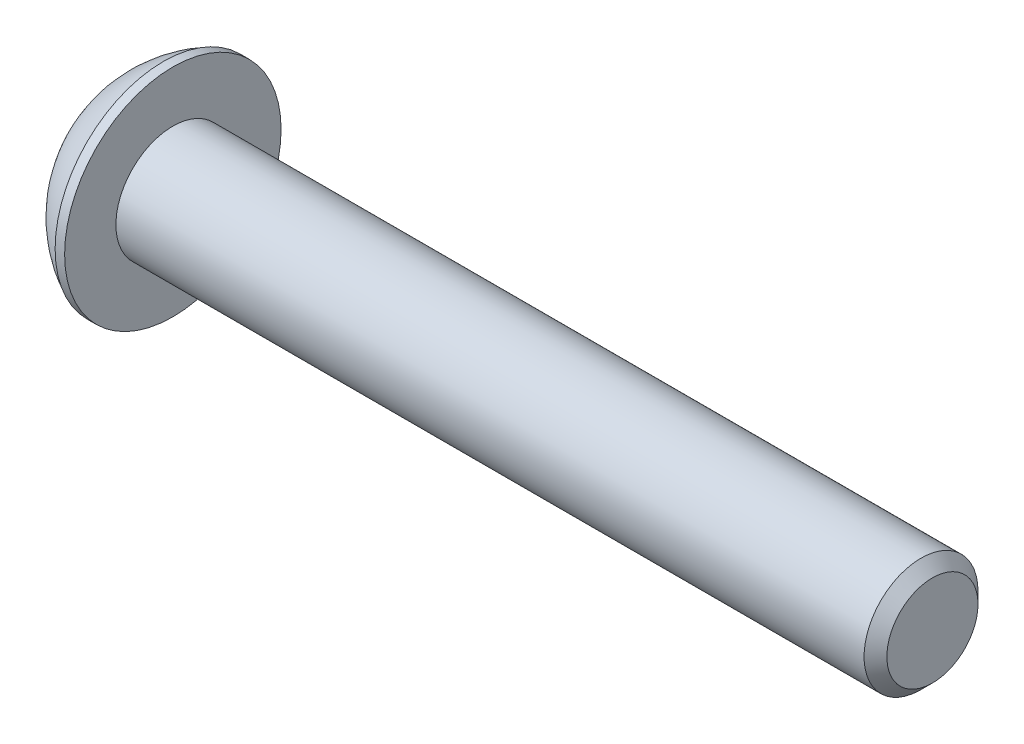
ISO-10303-21;
HEADER;
FILE_DESCRIPTION(('STEP AP214'),'2;1');
FILE_NAME('part.step','',(''),(''),'','','');
FILE_SCHEMA(('AUTOMOTIVE_DESIGN { 1 0 10303 214 1 1 1 1 }'));
ENDSEC;
DATA;
#1=APPLICATION_CONTEXT('core data for automotive mechanical design processes');
#2=APPLICATION_PROTOCOL_DEFINITION('international standard','automotive_design',2000,#1);
#3=PRODUCT_CONTEXT('',#1,'mechanical');
#4=PRODUCT('Part','Part','',(#3));
#5=PRODUCT_RELATED_PRODUCT_CATEGORY('part','',(#4));
#6=PRODUCT_DEFINITION_FORMATION('','',#4);
#7=PRODUCT_DEFINITION_CONTEXT('part definition',#1,'design');
#8=PRODUCT_DEFINITION('design','',#6,#7);
#9=PRODUCT_DEFINITION_SHAPE('','',#8);
#10=(LENGTH_UNIT() NAMED_UNIT(*) SI_UNIT(.MILLI.,.METRE.));
#11=(NAMED_UNIT(*) PLANE_ANGLE_UNIT() SI_UNIT($,.RADIAN.));
#12=(NAMED_UNIT(*) SI_UNIT($,.STERADIAN.) SOLID_ANGLE_UNIT());
#13=UNCERTAINTY_MEASURE_WITH_UNIT(LENGTH_MEASURE(1.E-05),#10,'distance_accuracy_value','');
#14=(GEOMETRIC_REPRESENTATION_CONTEXT(3) GLOBAL_UNCERTAINTY_ASSIGNED_CONTEXT((#13)) GLOBAL_UNIT_ASSIGNED_CONTEXT((#10,
#11,#12)) REPRESENTATION_CONTEXT('',''));
#15=CARTESIAN_POINT('',(0.,0.,0.));
#16=DIRECTION('',(0.,0.,1.));
#17=DIRECTION('',(1.,0.,0.));
#18=AXIS2_PLACEMENT_3D('',#15,#16,#17);
#19=CARTESIAN_POINT('',(-20.,0.,0.));
#20=DIRECTION('',(1.,0.,0.));
#21=DIRECTION('',(0.,0.,-1.));
#22=AXIS2_PLACEMENT_3D('',#19,#20,#21);
#23=CYLINDRICAL_SURFACE('',#22,1.5);
#24=CARTESIAN_POINT('',(-0.300000000000002,0.,0.));
#25=DIRECTION('',(1.,0.,0.));
#26=DIRECTION('',(0.,0.,-1.));
#27=AXIS2_PLACEMENT_3D('',#24,#25,#26);
#28=CIRCLE('',#27,1.5);
#29=CARTESIAN_POINT('',(-0.300000000000002,0.,-1.5));
#30=VERTEX_POINT('',#29);
#31=EDGE_CURVE('E45',#30,#30,#28,.F.);
#32=ORIENTED_EDGE('',*,*,#31,.T.);
#33=EDGE_LOOP('',(#32));
#34=FACE_BOUND('',#33,.T.);
#35=CARTESIAN_POINT('',(-20.,0.,0.));
#36=DIRECTION('',(-1.,0.,0.));
#37=DIRECTION('',(0.,-1.,0.));
#38=AXIS2_PLACEMENT_3D('',#35,#36,#37);
#39=CIRCLE('',#38,1.5);
#40=CARTESIAN_POINT('',(-20.,-1.50000000000001,0.));
#41=VERTEX_POINT('',#40);
#42=EDGE_CURVE('E124',#41,#41,#39,.F.);
#43=ORIENTED_EDGE('',*,*,#42,.T.);
#44=EDGE_LOOP('',(#43));
#45=FACE_BOUND('',#44,.T.);
#46=ADVANCED_FACE('F32',(#34,#45),#23,.T.);
#47=CARTESIAN_POINT('',(0.,0.,0.));
#48=DIRECTION('',(1.,0.,0.));
#49=DIRECTION('',(0.,0.,-1.));
#50=AXIS2_PLACEMENT_3D('',#47,#48,#49);
#51=PLANE('',#50);
#52=CARTESIAN_POINT('',(0.,0.,0.));
#53=DIRECTION('',(1.,0.,0.));
#54=DIRECTION('',(0.,0.,-1.));
#55=AXIS2_PLACEMENT_3D('',#52,#53,#54);
#56=CIRCLE('',#55,1.2);
#57=CARTESIAN_POINT('',(0.,0.,-1.2));
#58=VERTEX_POINT('',#57);
#59=EDGE_CURVE('E127',#58,#58,#56,.T.);
#60=ORIENTED_EDGE('',*,*,#59,.T.);
#61=EDGE_LOOP('',(#60));
#62=FACE_BOUND('',#61,.T.);
#63=ADVANCED_FACE('F137',(#62),#51,.T.);
#64=CARTESIAN_POINT('',(0.,0.,0.));
#65=DIRECTION('',(-1.,0.,0.));
#66=DIRECTION('',(0.,0.,1.));
#67=AXIS2_PLACEMENT_3D('',#64,#65,#66);
#68=CONICAL_SURFACE('',#67,1.2,0.785398163397447);
#69=ORIENTED_EDGE('',*,*,#31,.F.);
#70=EDGE_LOOP('',(#69));
#71=FACE_BOUND('',#70,.T.);
#72=ORIENTED_EDGE('',*,*,#59,.F.);
#73=EDGE_LOOP('',(#72));
#74=FACE_BOUND('',#73,.T.);
#75=ADVANCED_FACE('F34',(#71,#74),#68,.T.);
#76=CARTESIAN_POINT('',(-21.65,0.,0.));
#77=DIRECTION('',(1.,0.,0.));
#78=DIRECTION('',(0.,1.,0.));
#79=AXIS2_PLACEMENT_3D('',#76,#77,#78);
#80=PLANE('',#79);
#81=CARTESIAN_POINT('',(-21.65,0.,0.));
#82=DIRECTION('',(-1.,0.,0.));
#83=DIRECTION('',(0.,-1.,0.));
#84=AXIS2_PLACEMENT_3D('',#81,#82,#83);
#85=CIRCLE('',#84,1.20470053837926);
#86=CARTESIAN_POINT('',(-21.65,-1.20470053837926,0.));
#87=VERTEX_POINT('',#86);
#88=EDGE_CURVE('E241',#87,#87,#85,.T.);
#89=ORIENTED_EDGE('',*,*,#88,.F.);
#90=EDGE_LOOP('',(#89));
#91=FACE_BOUND('',#90,.T.);
#92=CARTESIAN_POINT('',(-21.65,0.,0.));
#93=DIRECTION('',(-1.,0.,0.));
#94=DIRECTION('',(0.,-1.,0.));
#95=AXIS2_PLACEMENT_3D('',#92,#93,#94);
#96=CIRCLE('',#95,1.5);
#97=CARTESIAN_POINT('',(-21.65,1.5,0.));
#98=VERTEX_POINT('',#97);
#99=EDGE_CURVE('E121',#98,#98,#96,.T.);
#100=ORIENTED_EDGE('',*,*,#99,.T.);
#101=EDGE_LOOP('',(#100));
#102=FACE_BOUND('',#101,.T.);
#103=ADVANCED_FACE('F136',(#91,#102),#80,.F.);
#104=CARTESIAN_POINT('',(-18.8526785714286,0.,0.));
#105=DIRECTION('',(-1.,0.,0.));
#106=DIRECTION('',(0.,1.,0.));
#107=AXIS2_PLACEMENT_3D('',#104,#105,#106);
#108=SPHERICAL_SURFACE('',#107,3.17411517981703);
#109=CARTESIAN_POINT('',(-20.25,0.,0.));
#110=DIRECTION('',(-1.,0.,0.));
#111=DIRECTION('',(0.,-1.,0.));
#112=AXIS2_PLACEMENT_3D('',#109,#110,#111);
#113=CIRCLE('',#112,2.85);
#114=CARTESIAN_POINT('',(-20.25,2.85,0.));
#115=VERTEX_POINT('',#114);
#116=EDGE_CURVE('E118',#115,#115,#113,.T.);
#117=CARTESIAN_POINT('',(-21.65,1.5,0.));
#118=CARTESIAN_POINT('',(-21.6402697017537,1.51814590550861,0.));
#119=CARTESIAN_POINT('',(-21.6303627914101,1.53619710575443,0.));
#120=CARTESIAN_POINT('',(-21.6101996026695,1.57210331824232,0.));
#121=CARTESIAN_POINT('',(-21.5999433242725,1.58995833048438,0.));
#122=CARTESIAN_POINT('',(-21.5790852555662,1.62546538948658,0.));
#123=CARTESIAN_POINT('',(-21.5684834652569,1.64311743624671,0.));
#124=CARTESIAN_POINT('',(-21.5469383951658,1.67821188357877,0.));
#125=CARTESIAN_POINT('',(-21.535995115384,1.69565428415069,0.));
#126=CARTESIAN_POINT('',(-21.513771208612,1.73032283245974,0.));
#127=CARTESIAN_POINT('',(-21.5024905816219,1.74754898019686,0.));
#128=CARTESIAN_POINT('',(-21.4795962529979,1.78177849951501,0.));
#129=CARTESIAN_POINT('',(-21.467982551364,1.79878187109604,0.));
#130=CARTESIAN_POINT('',(-21.4444264714719,1.8325593987641,0.));
#131=CARTESIAN_POINT('',(-21.4324840932136,1.84933355485113,0.));
#132=CARTESIAN_POINT('',(-21.4082751827463,1.88264629910089,0.));
#133=CARTESIAN_POINT('',(-21.3960086505372,1.89918488726362,0.));
#134=CARTESIAN_POINT('',(-21.3711560775515,1.93202023241769,0.));
#135=CARTESIAN_POINT('',(-21.3585700367748,1.94831698940903,0.));
#136=CARTESIAN_POINT('',(-21.3330832130497,1.98066250056316,0.));
#137=CARTESIAN_POINT('',(-21.3201824301012,1.99671125472595,0.));
#138=CARTESIAN_POINT('',(-21.2940710076189,2.02855468248374,0.));
#139=CARTESIAN_POINT('',(-21.2808603680851,2.04434935607873,0.));
#140=CARTESIAN_POINT('',(-21.254134235364,2.07567864118366,0.));
#141=CARTESIAN_POINT('',(-21.2406187421766,2.09121325269362,0.));
#142=CARTESIAN_POINT('',(-21.2132880205292,2.12201653059784,0.));
#143=CARTESIAN_POINT('',(-21.1994727920692,2.13728519699212,0.));
#144=CARTESIAN_POINT('',(-21.1715478317686,2.16755080234906,0.));
#145=CARTESIAN_POINT('',(-21.157438099928,2.18254774131173,0.));
#146=CARTESIAN_POINT('',(-21.1289294762883,2.21226421239399,0.));
#147=CARTESIAN_POINT('',(-21.1145305844891,2.22698374451358,0.));
#148=CARTESIAN_POINT('',(-21.0854490938605,2.25613982755347,0.));
#149=CARTESIAN_POINT('',(-21.0707664950309,2.27057637847377,0.));
#150=CARTESIAN_POINT('',(-21.0411231507109,2.29916103192521,0.));
#151=CARTESIAN_POINT('',(-21.0261624052204,2.31330913445635,0.));
#152=CARTESIAN_POINT('',(-20.9959684332833,2.34131153317633,0.));
#153=CARTESIAN_POINT('',(-20.9807352068367,2.35516582936518,0.));
#154=CARTESIAN_POINT('',(-20.9500020418819,2.38257536871332,0.));
#155=CARTESIAN_POINT('',(-20.9345021033738,2.3961306118726,0.));
#156=CARTESIAN_POINT('',(-20.9032413841958,2.42293691172714,0.));
#157=CARTESIAN_POINT('',(-20.887480603526,2.43618796842239,0.));
#158=CARTESIAN_POINT('',(-20.8557041687066,2.46238087711119,0.));
#159=CARTESIAN_POINT('',(-20.839688514557,2.47532272910475,0.));
#160=CARTESIAN_POINT('',(-20.8074083979817,2.50089232724988,0.));
#161=CARTESIAN_POINT('',(-20.7911439355561,2.51352007340145,0.));
#162=CARTESIAN_POINT('',(-20.7583723618573,2.53845667767541,0.));
#163=CARTESIAN_POINT('',(-20.7418652505841,2.5507655357978,0.));
#164=CARTESIAN_POINT('',(-20.7086146305115,2.57505970259155,0.));
#165=CARTESIAN_POINT('',(-20.691871121712,2.58704501126292,0.));
#166=CARTESIAN_POINT('',(-20.658154047431,2.61068754025891,0.));
#167=CARTESIAN_POINT('',(-20.6411804819494,2.62234476058354,0.));
#168=CARTESIAN_POINT('',(-20.607009722279,2.64532669825233,0.));
#169=CARTESIAN_POINT('',(-20.5898125280901,2.65665141559648,0.));
#170=CARTESIAN_POINT('',(-20.5552010236432,2.6789640585411,0.));
#171=CARTESIAN_POINT('',(-20.5377867133852,2.68995198414157,0.));
#172=CARTESIAN_POINT('',(-20.5027475717571,2.71158688256655,0.));
#173=CARTESIAN_POINT('',(-20.485122740387,2.72223385539107,0.));
#174=CARTESIAN_POINT('',(-20.449669230859,2.74318281565687,0.));
#175=CARTESIAN_POINT('',(-20.4318405527012,2.75348480309814,0.));
#176=CARTESIAN_POINT('',(-20.395986102456,2.7737398932333,0.));
#177=CARTESIAN_POINT('',(-20.3779603303685,2.78369299592719,0.));
#178=CARTESIAN_POINT('',(-20.3417185147769,2.8032465396409,0.));
#179=CARTESIAN_POINT('',(-20.3235024712727,2.81284698066071,0.));
#180=CARTESIAN_POINT('',(-20.2868870260232,2.83169159380608,0.));
#181=CARTESIAN_POINT('',(-20.268487624278,2.84093576593165,0.));
#182=CARTESIAN_POINT('',(-20.25,2.85,0.));
#183=B_SPLINE_CURVE_WITH_KNOTS('',3,(#117,#118,#119,#120,#121,#122,#123,#124,#125,#126,#127,
#128,#129,#130,#131,#132,#133,#134,#135,#136,#137,#138,#139,#140,#141,#142,#143,#144,#145,#146,
#147,#148,#149,#150,#151,#152,#153,#154,#155,#156,#157,#158,#159,#160,#161,#162,#163,#164,#165,
#166,#167,#168,#169,#170,#171,#172,#173,#174,#175,#176,#177,#178,#179,#180,#181,#182),
.UNSPECIFIED.,.F.,.F.,(4,2,2,2,2,2,2,2,2,2,2,2,2,2,2,2,2,2,2,2,2,2,2,2,2,2,2,2,2,2,2,2,4),(0.,
0.0617693508858102,0.123538701771619,0.185308052657428,0.247077403543238,0.308846754429047,
0.370616105314855,0.432385456200666,0.494154807086475,0.555924157972284,0.617693508858093,
0.679462859743903,0.741232210629712,0.80300156151552,0.864770912401332,0.92654026328714,
0.98830961417295,1.05007896505876,1.11184831594457,1.17361766683038,1.23538701771619,
1.297156368602,1.3589257194878,1.42069507037361,1.48246442125942,1.54423377214523,
1.60600312303104,1.66777247391685,1.72954182480266,1.79131117568847,1.85308052657428,
1.91484987746009,1.9766192283459),.UNSPECIFIED.);
#184=EDGE_CURVE('BSEAM148',#98,#115,#183,.T.);
#185=ORIENTED_EDGE('',*,*,#99,.F.);
#186=ORIENTED_EDGE('',*,*,#116,.T.);
#187=ORIENTED_EDGE('',*,*,#184,.T.);
#188=ORIENTED_EDGE('',*,*,#184,.F.);
#189=EDGE_LOOP('',(#185,#187,#186,#188));
#190=FACE_BOUND('',#189,.T.);
#191=ADVANCED_FACE('F148',(#190),#108,.T.);
#192=CARTESIAN_POINT('',(-20.,0.,0.));
#193=DIRECTION('',(-1.,0.,0.));
#194=DIRECTION('',(0.,-1.,0.));
#195=AXIS2_PLACEMENT_3D('',#192,#193,#194);
#196=CYLINDRICAL_SURFACE('',#195,2.85);
#197=ORIENTED_EDGE('',*,*,#116,.F.);
#198=EDGE_LOOP('',(#197));
#199=FACE_BOUND('',#198,.T.);
#200=CARTESIAN_POINT('',(-20.,0.,0.));
#201=DIRECTION('',(-1.,0.,0.));
#202=DIRECTION('',(0.,-1.,0.));
#203=AXIS2_PLACEMENT_3D('',#200,#201,#202);
#204=CIRCLE('',#203,2.85);
#205=CARTESIAN_POINT('',(-20.,-2.85,0.));
#206=VERTEX_POINT('',#205);
#207=EDGE_CURVE('E115',#206,#206,#204,.T.);
#208=ORIENTED_EDGE('',*,*,#207,.T.);
#209=EDGE_LOOP('',(#208));
#210=FACE_BOUND('',#209,.T.);
#211=ADVANCED_FACE('F152',(#199,#210),#196,.T.);
#212=CARTESIAN_POINT('',(-20.,2.85,0.));
#213=DIRECTION('',(-1.,0.,0.));
#214=DIRECTION('',(0.,-1.,0.));
#215=AXIS2_PLACEMENT_3D('',#212,#213,#214);
#216=PLANE('',#215);
#217=ORIENTED_EDGE('',*,*,#42,.F.);
#218=EDGE_LOOP('',(#217));
#219=FACE_BOUND('',#218,.T.);
#220=ORIENTED_EDGE('',*,*,#207,.F.);
#221=EDGE_LOOP('',(#220));
#222=FACE_BOUND('',#221,.T.);
#223=ADVANCED_FACE('F156',(#219,#222),#216,.F.);
#224=CARTESIAN_POINT('',(-21.65,0.,0.));
#225=DIRECTION('',(-1.,0.,0.));
#226=DIRECTION('',(0.,-1.,0.));
#227=AXIS2_PLACEMENT_3D('',#224,#225,#226);
#228=CONICAL_SURFACE('',#227,1.20470053837926,0.78539816339745);
#229=ORIENTED_EDGE('',*,*,#88,.T.);
#230=EDGE_LOOP('',(#229));
#231=FACE_BOUND('',#230,.T.);
#232=CARTESIAN_POINT('',(-22.0125645579163,-1.20678079288096,1.));
#233=CARTESIAN_POINT('',(-21.9901238799752,-1.17763239380938,1.));
#234=CARTESIAN_POINT('',(-21.9678867609271,-1.14832777655038,1.));
#235=CARTESIAN_POINT('',(-21.9239053230859,-1.0893407399734,1.));
#236=CARTESIAN_POINT('',(-21.902161120887,-1.05965823380996,1.));
#237=CARTESIAN_POINT('',(-21.8374858802222,-0.969511619364379,1.));
#238=CARTESIAN_POINT('',(-21.795456442765,-0.908390032886409,1.));
#239=CARTESIAN_POINT('',(-21.7124203349119,-0.779849899214032,1.));
#240=CARTESIAN_POINT('',(-21.6716484956871,-0.712278047733959,1.));
#241=CARTESIAN_POINT('',(-21.5967056855402,-0.573692441836176,1.));
#242=CARTESIAN_POINT('',(-21.5625124208036,-0.502691370033588,1.));
#243=CARTESIAN_POINT('',(-21.5206648240494,-0.396633108483669,1.));
#244=CARTESIAN_POINT('',(-21.508752424601,-0.363265114723097,1.));
#245=CARTESIAN_POINT('',(-21.4876010580815,-0.295675144863694,1.));
#246=CARTESIAN_POINT('',(-21.4783622608543,-0.261453114661034,1.));
#247=CARTESIAN_POINT('',(-21.4632108375931,-0.192964714439428,1.));
#248=CARTESIAN_POINT('',(-21.4572372079353,-0.158712062702433,1.));
#249=CARTESIAN_POINT('',(-21.4487381792859,-0.0897678989597915,1.));
#250=CARTESIAN_POINT('',(-21.4462131691607,-0.0550763379077936,1.));
#251=CARTESIAN_POINT('',(-21.4448308242394,0.0128534343371981,1.));
#252=CARTESIAN_POINT('',(-21.4458171333425,0.0460884918414635,1.));
#253=CARTESIAN_POINT('',(-21.4510428296463,0.112288777523351,1.));
#254=CARTESIAN_POINT('',(-21.4552814228284,0.145254069576923,1.));
#255=CARTESIAN_POINT('',(-21.4668431932388,0.21125264171047,1.));
#256=CARTESIAN_POINT('',(-21.4742213991969,0.244276126106413,1.));
#257=CARTESIAN_POINT('',(-21.4916537633013,0.309593416178903,1.));
#258=CARTESIAN_POINT('',(-21.5017077720937,0.341887262472133,1.));
#259=CARTESIAN_POINT('',(-21.5364692676108,0.441188556116711,1.));
#260=CARTESIAN_POINT('',(-21.5650343603337,0.506841480843482,1.));
#261=CARTESIAN_POINT('',(-21.6286033694253,0.635081389212368,1.));
#262=CARTESIAN_POINT('',(-21.663629955309,0.697656564069528,1.));
#263=CARTESIAN_POINT('',(-21.7359546107891,0.817274369694617,1.));
#264=CARTESIAN_POINT('',(-21.7730556162911,0.874437672313585,1.));
#265=CARTESIAN_POINT('',(-21.8304371678966,0.958655710303488,1.));
#266=CARTESIAN_POINT('',(-21.8497720189249,0.986366163766956,1.));
#267=CARTESIAN_POINT('',(-21.8889602713879,1.0414069197441,1.));
#268=CARTESIAN_POINT('',(-21.908813529201,1.06873732439882,1.));
#269=CARTESIAN_POINT('',(-21.92888195229,1.0959092145887,1.));
#270=B_SPLINE_CURVE_WITH_KNOTS('',3,(#232,#233,#234,#235,#236,#237,#238,#239,#240,#241,#242,
#243,#244,#245,#246,#247,#248,#249,#250,#251,#252,#253,#254,#255,#256,#257,#258,#259,#260,#261,
#262,#263,#264,#265,#266,#267,#268,#269),.UNSPECIFIED.,.F.,.F.,(4,2,2,2,2,2,2,2,2,2,2,2,2,2,2,2,
2,2,4),(0.,0.110355487284535,0.220736811203827,0.443178348562915,0.679759335181122,
0.915523888816465,1.02172703810025,1.1279369325962,1.23208803653002,1.33625088357216,
1.43583459192535,1.53539399546241,1.63677534642523,1.73815103982915,1.95232008261278,
2.16725532249797,2.37159620059983,2.47295962852456,2.57429526618464),.UNSPECIFIED.);
#271=CARTESIAN_POINT('',(-21.6,-0.577350269189631,1.));
#272=VERTEX_POINT('',#271);
#273=CARTESIAN_POINT('',(-21.6,0.577350269189621,1.));
#274=VERTEX_POINT('',#273);
#275=EDGE_CURVE('E99',#272,#274,#270,.T.);
#276=ORIENTED_EDGE('',*,*,#275,.F.);
#277=CARTESIAN_POINT('',(-21.6001154873726,-1.15481600843309,-0.000200000000000077));
#278=CARTESIAN_POINT('',(-21.5802779308257,-1.13496520795026,0.0341825950071805));
#279=CARTESIAN_POINT('',(-21.5616050206389,-1.11478247255943,0.0691401181398245));
#280=CARTESIAN_POINT('',(-21.5274147427232,-1.0736273952922,0.140422802956089));
#281=CARTESIAN_POINT('',(-21.5119164090235,-1.0526511355808,0.176754750528984));
#282=CARTESIAN_POINT('',(-21.4853673071423,-1.01035337909804,0.250016613803311));
#283=CARTESIAN_POINT('',(-21.4742497739969,-0.989042666109245,0.286927851445414));
#284=CARTESIAN_POINT('',(-21.4571198657762,-0.945952199282696,0.361562729310859));
#285=CARTESIAN_POINT('',(-21.4510946974667,-0.924173762626601,0.399284088108635));
#286=CARTESIAN_POINT('',(-21.4456605549675,-0.886641312640019,0.464292198417933));
#287=CARTESIAN_POINT('',(-21.4448569383167,-0.87093613067228,0.491494371528172));
#288=CARTESIAN_POINT('',(-21.4462066994169,-0.839556179862853,0.545846040669111));
#289=CARTESIAN_POINT('',(-21.4483607295472,-0.823881418494928,0.572995523754875));
#290=CARTESIAN_POINT('',(-21.4591169721285,-0.777080970599371,0.65405627732696));
#291=CARTESIAN_POINT('',(-21.4720145564154,-0.746188191116435,0.707564140978427));
#292=CARTESIAN_POINT('',(-21.5031407306022,-0.691968116419654,0.801476065143432));
#293=CARTESIAN_POINT('',(-21.5197377977018,-0.668386557293376,0.842320523671835));
#294=CARTESIAN_POINT('',(-21.5571249246853,-0.622147085933686,0.922409637381944));
#295=CARTESIAN_POINT('',(-21.5779013418174,-0.59948644958458,0.961659010870438));
#296=CARTESIAN_POINT('',(-21.6001154873726,-0.577234799135793,1.0002));
#297=B_SPLINE_CURVE_WITH_KNOTS('',3,(#277,#278,#279,#280,#281,#282,#283,#284,#285,#286,#287,
#288,#289,#290,#291,#292,#293,#294,#295,#296),.UNSPECIFIED.,.F.,.F.,(4,2,2,2,2,2,2,2,2,4),(0.,
0.133237676828558,0.267252229834489,0.399137076269299,0.530689603280767,0.624814864263845,
0.718960890149132,0.907306626112096,1.0571010036179,1.20641411519286),.UNSPECIFIED.);
#298=CARTESIAN_POINT('',(-21.6,-1.15470053837926,0.));
#299=VERTEX_POINT('',#298);
#300=EDGE_CURVE('E198',#299,#272,#297,.T.);
#301=ORIENTED_EDGE('',*,*,#300,.F.);
#302=CARTESIAN_POINT('',(-21.6001154873726,-0.577234799135793,-1.0002));
#303=CARTESIAN_POINT('',(-21.5802779308257,-0.597085599618626,-0.965817404992819));
#304=CARTESIAN_POINT('',(-21.5616050206389,-0.617268335009461,-0.930859881860175));
#305=CARTESIAN_POINT('',(-21.5274147427232,-0.65842341227669,-0.85957719704391));
#306=CARTESIAN_POINT('',(-21.5119164090235,-0.679399671988084,-0.823245249471016));
#307=CARTESIAN_POINT('',(-21.4853673071423,-0.721697428470851,-0.749983386196689));
#308=CARTESIAN_POINT('',(-21.4742497739969,-0.743008141459641,-0.713072148554586));
#309=CARTESIAN_POINT('',(-21.4571198657762,-0.786098608286191,-0.638437270689141));
#310=CARTESIAN_POINT('',(-21.4510946974667,-0.807877044942285,-0.600715911891364));
#311=CARTESIAN_POINT('',(-21.4456605549675,-0.845409494928867,-0.535707801582067));
#312=CARTESIAN_POINT('',(-21.4448569383167,-0.861114676896606,-0.508505628471828));
#313=CARTESIAN_POINT('',(-21.4462066994169,-0.892494627706034,-0.454153959330888));
#314=CARTESIAN_POINT('',(-21.4483607295472,-0.908169389073958,-0.427004476245125));
#315=CARTESIAN_POINT('',(-21.4591169721285,-0.954969836969515,-0.34594372267304));
#316=CARTESIAN_POINT('',(-21.4720145564153,-0.985862616452452,-0.292435859021573));
#317=CARTESIAN_POINT('',(-21.5031407306022,-1.04008269114923,-0.198523934856569));
#318=CARTESIAN_POINT('',(-21.5197377977018,-1.06366425027551,-0.157679476328167));
#319=CARTESIAN_POINT('',(-21.5571249246853,-1.1099037216352,-0.0775903626180577));
#320=CARTESIAN_POINT('',(-21.5779013418174,-1.13256435798431,-0.0383409891295639));
#321=CARTESIAN_POINT('',(-21.6001154873726,-1.15481600843309,0.0001999999999986));
#322=B_SPLINE_CURVE_WITH_KNOTS('',3,(#302,#303,#304,#305,#306,#307,#308,#309,#310,#311,#312,
#313,#314,#315,#316,#317,#318,#319,#320,#321),.UNSPECIFIED.,.F.,.F.,(4,2,2,2,2,2,2,2,2,4),(0.,
0.133237676828558,0.267252229834489,0.399137076269299,0.530689603280767,0.624814864263845,
0.718960890149132,0.907306626112096,1.05710100361789,1.20641411519286),.UNSPECIFIED.);
#323=CARTESIAN_POINT('',(-21.6,-0.57735026918963,-1.));
#324=VERTEX_POINT('',#323);
#325=EDGE_CURVE('E193',#324,#299,#322,.T.);
#326=ORIENTED_EDGE('',*,*,#325,.F.);
#327=CARTESIAN_POINT('',(-22.0125645579163,-1.20678079288096,-1.));
#328=CARTESIAN_POINT('',(-21.9901238799752,-1.17763239380938,-1.));
#329=CARTESIAN_POINT('',(-21.9678867609271,-1.14832777655038,-1.));
#330=CARTESIAN_POINT('',(-21.9239053230859,-1.0893407399734,-1.));
#331=CARTESIAN_POINT('',(-21.902161120887,-1.05965823380996,-1.));
#332=CARTESIAN_POINT('',(-21.8374858802222,-0.969511619364379,-1.));
#333=CARTESIAN_POINT('',(-21.795456442765,-0.908390032886409,-1.));
#334=CARTESIAN_POINT('',(-21.7124203349119,-0.779849899214033,-1.));
#335=CARTESIAN_POINT('',(-21.6716484956871,-0.712278047733959,-1.));
#336=CARTESIAN_POINT('',(-21.5967056855402,-0.573692441836176,-1.));
#337=CARTESIAN_POINT('',(-21.5625124208036,-0.502691370033588,-1.));
#338=CARTESIAN_POINT('',(-21.5206648240494,-0.396633108483668,-1.));
#339=CARTESIAN_POINT('',(-21.508752424601,-0.363265114723097,-1.));
#340=CARTESIAN_POINT('',(-21.4876010580815,-0.295675144863694,-1.));
#341=CARTESIAN_POINT('',(-21.4783622608543,-0.261453114661033,-1.));
#342=CARTESIAN_POINT('',(-21.4632108375931,-0.192964714439427,-1.));
#343=CARTESIAN_POINT('',(-21.4572372079353,-0.158712062702432,-1.));
#344=CARTESIAN_POINT('',(-21.4487381792859,-0.0897678989597899,-1.));
#345=CARTESIAN_POINT('',(-21.4462131691607,-0.0550763379077919,-1.));
#346=CARTESIAN_POINT('',(-21.4448308242394,0.0128534343372,-1.));
#347=CARTESIAN_POINT('',(-21.4458171333425,0.0460884918414654,-1.));
#348=CARTESIAN_POINT('',(-21.4510428296463,0.112288777523353,-1.));
#349=CARTESIAN_POINT('',(-21.4552814228284,0.145254069576925,-1.));
#350=CARTESIAN_POINT('',(-21.4668431932388,0.211252641710472,-1.));
#351=CARTESIAN_POINT('',(-21.4742213991969,0.244276126106415,-1.));
#352=CARTESIAN_POINT('',(-21.4916537633013,0.309593416178905,-1.));
#353=CARTESIAN_POINT('',(-21.5017077720937,0.341887262472135,-1.));
#354=CARTESIAN_POINT('',(-21.5364692676108,0.441188556116713,-1.));
#355=CARTESIAN_POINT('',(-21.5650343603337,0.506841480843486,-1.));
#356=CARTESIAN_POINT('',(-21.6286033694253,0.635081389212372,-1.));
#357=CARTESIAN_POINT('',(-21.663629955309,0.697656564069531,-1.));
#358=CARTESIAN_POINT('',(-21.7359546107891,0.817274369694619,-1.));
#359=CARTESIAN_POINT('',(-21.7730556162911,0.874437672313588,-1.));
#360=CARTESIAN_POINT('',(-21.8304371678966,0.958655710303492,-1.));
#361=CARTESIAN_POINT('',(-21.8497720189249,0.986366163766959,-1.));
#362=CARTESIAN_POINT('',(-21.8889602713879,1.0414069197441,-1.));
#363=CARTESIAN_POINT('',(-21.908813529201,1.06873732439882,-1.));
#364=CARTESIAN_POINT('',(-21.92888195229,1.0959092145887,-1.));
#365=B_SPLINE_CURVE_WITH_KNOTS('',3,(#327,#328,#329,#330,#331,#332,#333,#334,#335,#336,#337,
#338,#339,#340,#341,#342,#343,#344,#345,#346,#347,#348,#349,#350,#351,#352,#353,#354,#355,#356,
#357,#358,#359,#360,#361,#362,#363,#364),.UNSPECIFIED.,.F.,.F.,(4,2,2,2,2,2,2,2,2,2,2,2,2,2,2,2,
2,2,4),(0.,0.110355487284534,0.220736811203826,0.443178348562914,0.679759335181121,
0.915523888816464,1.02172703810024,1.1279369325962,1.23208803653002,1.33625088357217,
1.43583459192535,1.53539399546241,1.63677534642523,1.73815103982915,1.95232008261278,
2.16725532249797,2.37159620059983,2.47295962852456,2.57429526618464),.UNSPECIFIED.);
#366=CARTESIAN_POINT('',(-21.6,0.577350269189621,-1.));
#367=VERTEX_POINT('',#366);
#368=EDGE_CURVE('E52',#367,#324,#365,.F.);
#369=ORIENTED_EDGE('',*,*,#368,.F.);
#370=CARTESIAN_POINT('',(-21.6001154873726,1.15481600843308,0.000199999999999837));
#371=CARTESIAN_POINT('',(-21.5802779308257,1.13496520795025,-0.0341825950071808));
#372=CARTESIAN_POINT('',(-21.5616050206389,1.11478247255942,-0.0691401181398248));
#373=CARTESIAN_POINT('',(-21.5274147427232,1.07362739529219,-0.140422802956089));
#374=CARTESIAN_POINT('',(-21.5119164090235,1.05265113558079,-0.176754750528984));
#375=CARTESIAN_POINT('',(-21.4853673071423,1.01035337909803,-0.250016613803311));
#376=CARTESIAN_POINT('',(-21.4742497739969,0.989042666109236,-0.286927851445414));
#377=CARTESIAN_POINT('',(-21.4571198657762,0.945952199282687,-0.361562729310859));
#378=CARTESIAN_POINT('',(-21.4510946974667,0.924173762626592,-0.399284088108636));
#379=CARTESIAN_POINT('',(-21.4456605549675,0.88664131264001,-0.464292198417933));
#380=CARTESIAN_POINT('',(-21.4448569383167,0.870936130672271,-0.491494371528172));
#381=CARTESIAN_POINT('',(-21.4462066994169,0.839556179862844,-0.545846040669112));
#382=CARTESIAN_POINT('',(-21.4483607295472,0.823881418494919,-0.572995523754875));
#383=CARTESIAN_POINT('',(-21.4591169721285,0.777080970599362,-0.65405627732696));
#384=CARTESIAN_POINT('',(-21.4720145564153,0.746188191116426,-0.707564140978427));
#385=CARTESIAN_POINT('',(-21.5031407306022,0.691968116419645,-0.801476065143431));
#386=CARTESIAN_POINT('',(-21.5197377977018,0.668386557293367,-0.842320523671833));
#387=CARTESIAN_POINT('',(-21.5571249246853,0.622147085933678,-0.922409637381943));
#388=CARTESIAN_POINT('',(-21.5779013418174,0.599486449584571,-0.961659010870437));
#389=CARTESIAN_POINT('',(-21.6001154873726,0.577234799135784,-1.0002));
#390=B_SPLINE_CURVE_WITH_KNOTS('',3,(#370,#371,#372,#373,#374,#375,#376,#377,#378,#379,#380,
#381,#382,#383,#384,#385,#386,#387,#388,#389),.UNSPECIFIED.,.F.,.F.,(4,2,2,2,2,2,2,2,2,4),(0.,
0.133237676828558,0.267252229834489,0.399137076269299,0.530689603280767,0.624814864263845,
0.718960890149132,0.907306626112096,1.05710100361789,1.20641411519286),.UNSPECIFIED.);
#391=CARTESIAN_POINT('',(-21.6,1.15470053837925,0.));
#392=VERTEX_POINT('',#391);
#393=EDGE_CURVE('E11',#392,#367,#390,.T.);
#394=ORIENTED_EDGE('',*,*,#393,.F.);
#395=CARTESIAN_POINT('',(-21.6001154873726,0.577234799135783,1.0002));
#396=CARTESIAN_POINT('',(-21.5802779308257,0.597085599618617,0.965817404992818));
#397=CARTESIAN_POINT('',(-21.5616050206389,0.617268335009451,0.930859881860175));
#398=CARTESIAN_POINT('',(-21.5274147427232,0.658423412276681,0.85957719704391));
#399=CARTESIAN_POINT('',(-21.5119164090235,0.679399671988075,0.823245249471016));
#400=CARTESIAN_POINT('',(-21.4853673071423,0.721697428470841,0.749983386196689));
#401=CARTESIAN_POINT('',(-21.4742497739969,0.743008141459632,0.713072148554586));
#402=CARTESIAN_POINT('',(-21.4571198657762,0.786098608286181,0.638437270689141));
#403=CARTESIAN_POINT('',(-21.4510946974667,0.807877044942276,0.600715911891364));
#404=CARTESIAN_POINT('',(-21.4456605549675,0.845409494928858,0.535707801582066));
#405=CARTESIAN_POINT('',(-21.4448569383167,0.861114676896597,0.508505628471828));
#406=CARTESIAN_POINT('',(-21.4462066994169,0.892494627706024,0.454153959330888));
#407=CARTESIAN_POINT('',(-21.4483607295472,0.908169389073949,0.427004476245124));
#408=CARTESIAN_POINT('',(-21.4591169721285,0.954969836969506,0.34594372267304));
#409=CARTESIAN_POINT('',(-21.4720145564154,0.985862616452442,0.292435859021573));
#410=CARTESIAN_POINT('',(-21.5031407306022,1.04008269114922,0.198523934856568));
#411=CARTESIAN_POINT('',(-21.5197377977018,1.0636642502755,0.157679476328165));
#412=CARTESIAN_POINT('',(-21.5571249246853,1.10990372163519,0.077590362618056));
#413=CARTESIAN_POINT('',(-21.5779013418174,1.1325643579843,0.0383409891295627));
#414=CARTESIAN_POINT('',(-21.6001154873726,1.15481600843308,-0.000199999999998891));
#415=B_SPLINE_CURVE_WITH_KNOTS('',3,(#395,#396,#397,#398,#399,#400,#401,#402,#403,#404,#405,
#406,#407,#408,#409,#410,#411,#412,#413,#414),.UNSPECIFIED.,.F.,.F.,(4,2,2,2,2,2,2,2,2,4),(0.,
0.133237676828558,0.267252229834489,0.399137076269299,0.530689603280767,0.624814864263845,
0.718960890149132,0.907306626112096,1.05710100361789,1.20641411519286),.UNSPECIFIED.);
#416=EDGE_CURVE('E90',#274,#392,#415,.T.);
#417=ORIENTED_EDGE('',*,*,#416,.F.);
#418=EDGE_LOOP('',(#276,#301,#326,#369,#394,#417));
#419=FACE_BOUND('',#418,.T.);
#420=ADVANCED_FACE('F89',(#231,#419),#228,.F.);
#421=CARTESIAN_POINT('',(-20.45,0.,0.));
#422=DIRECTION('',(-1.,0.,0.));
#423=DIRECTION('',(0.,0.,1.));
#424=AXIS2_PLACEMENT_3D('',#421,#422,#423);
#425=PLANE('',#424);
#426=DIRECTION('',(0.,0.5,-0.866025403784439));
#427=VECTOR('',#426,1.);
#428=CARTESIAN_POINT('',(-20.45,0.577350269189621,1.));
#429=LINE('',#428,#427);
#430=CARTESIAN_POINT('',(-20.45,0.577350269189621,1.));
#431=VERTEX_POINT('',#430);
#432=CARTESIAN_POINT('',(-20.45,1.15470053837925,0.));
#433=VERTEX_POINT('',#432);
#434=EDGE_CURVE('E98',#431,#433,#429,.T.);
#435=ORIENTED_EDGE('',*,*,#434,.T.);
#436=DIRECTION('',(0.,-0.5,-0.866025403784439));
#437=VECTOR('',#436,1.);
#438=CARTESIAN_POINT('',(-20.45,1.15470053837925,0.));
#439=LINE('',#438,#437);
#440=CARTESIAN_POINT('',(-20.45,0.577350269189621,-1.));
#441=VERTEX_POINT('',#440);
#442=EDGE_CURVE('E103',#433,#441,#439,.T.);
#443=ORIENTED_EDGE('',*,*,#442,.T.);
#444=DIRECTION('',(0.,-1.,0.));
#445=VECTOR('',#444,1.);
#446=CARTESIAN_POINT('',(-20.45,0.577350269189621,-1.));
#447=LINE('',#446,#445);
#448=CARTESIAN_POINT('',(-20.45,-0.57735026918963,-1.));
#449=VERTEX_POINT('',#448);
#450=EDGE_CURVE('E223',#441,#449,#447,.T.);
#451=ORIENTED_EDGE('',*,*,#450,.T.);
#452=DIRECTION('',(0.,-0.5,0.866025403784439));
#453=VECTOR('',#452,1.);
#454=CARTESIAN_POINT('',(-20.45,-0.57735026918963,-1.));
#455=LINE('',#454,#453);
#456=CARTESIAN_POINT('',(-20.45,-1.15470053837926,0.));
#457=VERTEX_POINT('',#456);
#458=EDGE_CURVE('E227',#449,#457,#455,.T.);
#459=ORIENTED_EDGE('',*,*,#458,.T.);
#460=DIRECTION('',(0.,0.5,0.866025403784439));
#461=VECTOR('',#460,1.);
#462=CARTESIAN_POINT('',(-20.45,-1.15470053837926,0.));
#463=LINE('',#462,#461);
#464=CARTESIAN_POINT('',(-20.45,-0.577350269189631,1.));
#465=VERTEX_POINT('',#464);
#466=EDGE_CURVE('E111',#457,#465,#463,.T.);
#467=ORIENTED_EDGE('',*,*,#466,.T.);
#468=DIRECTION('',(0.,1.,0.));
#469=VECTOR('',#468,1.);
#470=CARTESIAN_POINT('',(-20.45,-0.577350269189631,1.));
#471=LINE('',#470,#469);
#472=EDGE_CURVE('E106',#465,#431,#471,.T.);
#473=ORIENTED_EDGE('',*,*,#472,.T.);
#474=EDGE_LOOP('',(#435,#443,#451,#459,#467,#473));
#475=FACE_BOUND('',#474,.T.);
#476=ADVANCED_FACE('F180',(#475),#425,.T.);
#477=CARTESIAN_POINT('',(-20.45,1.15470053837925,0.));
#478=DIRECTION('',(0.,0.866025403784439,-0.5));
#479=DIRECTION('',(0.,0.5,0.866025403784439));
#480=AXIS2_PLACEMENT_3D('',#477,#478,#479);
#481=PLANE('',#480);
#482=DIRECTION('',(-1.,0.,0.));
#483=VECTOR('',#482,1.);
#484=CARTESIAN_POINT('',(-20.45,1.15470053837925,0.));
#485=LINE('',#484,#483);
#486=EDGE_CURVE('E96',#433,#392,#485,.T.);
#487=ORIENTED_EDGE('',*,*,#486,.T.);
#488=ORIENTED_EDGE('',*,*,#393,.T.);
#489=DIRECTION('',(-1.,0.,0.));
#490=VECTOR('',#489,1.);
#491=CARTESIAN_POINT('',(-20.45,0.577350269189621,-1.));
#492=LINE('',#491,#490);
#493=EDGE_CURVE('E105',#441,#367,#492,.T.);
#494=ORIENTED_EDGE('',*,*,#493,.F.);
#495=ORIENTED_EDGE('',*,*,#442,.F.);
#496=EDGE_LOOP('',(#487,#488,#494,#495));
#497=FACE_BOUND('',#496,.T.);
#498=ADVANCED_FACE('F101',(#497),#481,.F.);
#499=CARTESIAN_POINT('',(-20.45,0.577350269189621,-1.));
#500=DIRECTION('',(0.,0.,-1.));
#501=DIRECTION('',(-1.,0.,0.));
#502=AXIS2_PLACEMENT_3D('',#499,#500,#501);
#503=PLANE('',#502);
#504=ORIENTED_EDGE('',*,*,#493,.T.);
#505=ORIENTED_EDGE('',*,*,#368,.T.);
#506=DIRECTION('',(-1.,0.,0.));
#507=VECTOR('',#506,1.);
#508=CARTESIAN_POINT('',(-20.45,-0.57735026918963,-1.));
#509=LINE('',#508,#507);
#510=EDGE_CURVE('E108',#449,#324,#509,.T.);
#511=ORIENTED_EDGE('',*,*,#510,.F.);
#512=ORIENTED_EDGE('',*,*,#450,.F.);
#513=EDGE_LOOP('',(#504,#505,#511,#512));
#514=FACE_BOUND('',#513,.T.);
#515=ADVANCED_FACE('F212',(#514),#503,.F.);
#516=CARTESIAN_POINT('',(-20.45,-0.57735026918963,-1.));
#517=DIRECTION('',(0.,-0.866025403784439,-0.5));
#518=DIRECTION('',(0.,0.5,-0.866025403784439));
#519=AXIS2_PLACEMENT_3D('',#516,#517,#518);
#520=PLANE('',#519);
#521=ORIENTED_EDGE('',*,*,#510,.T.);
#522=ORIENTED_EDGE('',*,*,#325,.T.);
#523=DIRECTION('',(-1.,0.,0.));
#524=VECTOR('',#523,1.);
#525=CARTESIAN_POINT('',(-20.45,-1.15470053837926,0.));
#526=LINE('',#525,#524);
#527=EDGE_CURVE('E237',#457,#299,#526,.T.);
#528=ORIENTED_EDGE('',*,*,#527,.F.);
#529=ORIENTED_EDGE('',*,*,#458,.F.);
#530=EDGE_LOOP('',(#521,#522,#528,#529));
#531=FACE_BOUND('',#530,.T.);
#532=ADVANCED_FACE('F207',(#531),#520,.F.);
#533=CARTESIAN_POINT('',(-20.45,-1.15470053837926,0.));
#534=DIRECTION('',(0.,-0.866025403784439,0.5));
#535=DIRECTION('',(0.,-0.5,-0.866025403784439));
#536=AXIS2_PLACEMENT_3D('',#533,#534,#535);
#537=PLANE('',#536);
#538=ORIENTED_EDGE('',*,*,#527,.T.);
#539=ORIENTED_EDGE('',*,*,#300,.T.);
#540=DIRECTION('',(-1.,0.,0.));
#541=VECTOR('',#540,1.);
#542=CARTESIAN_POINT('',(-20.45,-0.577350269189631,1.));
#543=LINE('',#542,#541);
#544=EDGE_CURVE('E234',#465,#272,#543,.T.);
#545=ORIENTED_EDGE('',*,*,#544,.F.);
#546=ORIENTED_EDGE('',*,*,#466,.F.);
#547=EDGE_LOOP('',(#538,#539,#545,#546));
#548=FACE_BOUND('',#547,.T.);
#549=ADVANCED_FACE('F204',(#548),#537,.F.);
#550=CARTESIAN_POINT('',(-20.45,-0.577350269189631,1.));
#551=DIRECTION('',(0.,0.,1.));
#552=DIRECTION('',(1.,0.,0.));
#553=AXIS2_PLACEMENT_3D('',#550,#551,#552);
#554=PLANE('',#553);
#555=ORIENTED_EDGE('',*,*,#544,.T.);
#556=ORIENTED_EDGE('',*,*,#275,.T.);
#557=DIRECTION('',(-1.,0.,0.));
#558=VECTOR('',#557,1.);
#559=CARTESIAN_POINT('',(-20.45,0.577350269189621,1.));
#560=LINE('',#559,#558);
#561=EDGE_CURVE('E59',#431,#274,#560,.T.);
#562=ORIENTED_EDGE('',*,*,#561,.F.);
#563=ORIENTED_EDGE('',*,*,#472,.F.);
#564=EDGE_LOOP('',(#555,#556,#562,#563));
#565=FACE_BOUND('',#564,.T.);
#566=ADVANCED_FACE('F163',(#565),#554,.F.);
#567=CARTESIAN_POINT('',(-20.45,0.577350269189621,1.));
#568=DIRECTION('',(0.,0.866025403784439,0.5));
#569=DIRECTION('',(0.,-0.5,0.866025403784439));
#570=AXIS2_PLACEMENT_3D('',#567,#568,#569);
#571=PLANE('',#570);
#572=ORIENTED_EDGE('',*,*,#561,.T.);
#573=ORIENTED_EDGE('',*,*,#416,.T.);
#574=ORIENTED_EDGE('',*,*,#486,.F.);
#575=ORIENTED_EDGE('',*,*,#434,.F.);
#576=EDGE_LOOP('',(#572,#573,#574,#575));
#577=FACE_BOUND('',#576,.T.);
#578=ADVANCED_FACE('F95',(#577),#571,.F.);
#579=CLOSED_SHELL('',(#46,#63,#75,#103,#191,#211,#223,#420,#476,#498,#515,#532,#549,#566,#578));
#580=MANIFOLD_SOLID_BREP('B2',#579);
#581=ADVANCED_BREP_SHAPE_REPRESENTATION('',(#18,#580),#14);
#582=SHAPE_DEFINITION_REPRESENTATION(#9,#581);
ENDSEC;
END-ISO-10303-21;
